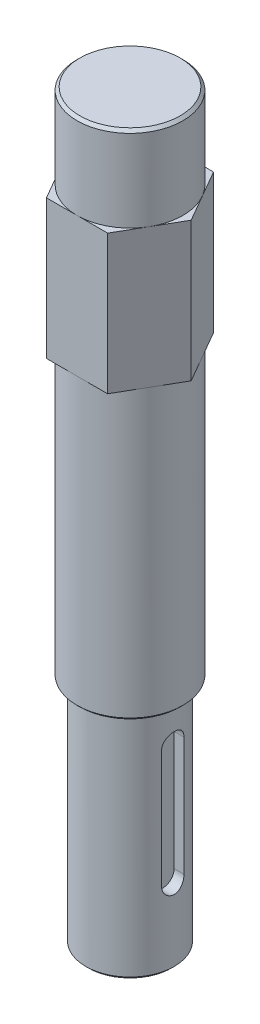
ISO-10303-21;
HEADER;
FILE_DESCRIPTION(('STEP AP214'),'2;1');
FILE_NAME('part.step','',(''),(''),'','','');
FILE_SCHEMA(('AUTOMOTIVE_DESIGN { 1 0 10303 214 1 1 1 1 }'));
ENDSEC;
DATA;
#1=APPLICATION_CONTEXT('core data for automotive mechanical design processes');
#2=APPLICATION_PROTOCOL_DEFINITION('international standard','automotive_design',2000,#1);
#3=PRODUCT_CONTEXT('',#1,'mechanical');
#4=PRODUCT('Part','Part','',(#3));
#5=PRODUCT_RELATED_PRODUCT_CATEGORY('part','',(#4));
#6=PRODUCT_DEFINITION_FORMATION('','',#4);
#7=PRODUCT_DEFINITION_CONTEXT('part definition',#1,'design');
#8=PRODUCT_DEFINITION('design','',#6,#7);
#9=PRODUCT_DEFINITION_SHAPE('','',#8);
#10=(LENGTH_UNIT() NAMED_UNIT(*) SI_UNIT(.MILLI.,.METRE.));
#11=(NAMED_UNIT(*) PLANE_ANGLE_UNIT() SI_UNIT($,.RADIAN.));
#12=(NAMED_UNIT(*) SI_UNIT($,.STERADIAN.) SOLID_ANGLE_UNIT());
#13=UNCERTAINTY_MEASURE_WITH_UNIT(LENGTH_MEASURE(1.E-05),#10,'distance_accuracy_value','');
#14=(GEOMETRIC_REPRESENTATION_CONTEXT(3) GLOBAL_UNCERTAINTY_ASSIGNED_CONTEXT((#13)) GLOBAL_UNIT_ASSIGNED_CONTEXT((#10,
#11,#12)) REPRESENTATION_CONTEXT('',''));
#15=CARTESIAN_POINT('',(0.,0.,0.));
#16=DIRECTION('',(0.,0.,1.));
#17=DIRECTION('',(1.,0.,0.));
#18=AXIS2_PLACEMENT_3D('',#15,#16,#17);
#19=CARTESIAN_POINT('',(0.,66.675,0.));
#20=DIRECTION('',(0.,1.,0.));
#21=DIRECTION('',(0.,0.,1.));
#22=AXIS2_PLACEMENT_3D('',#19,#20,#21);
#23=PLANE('',#22);
#24=CARTESIAN_POINT('',(0.,66.6749999999752,0.));
#25=DIRECTION('',(0.,-1.,0.));
#26=DIRECTION('',(0.,0.,-1.));
#27=AXIS2_PLACEMENT_3D('',#24,#25,#26);
#28=CIRCLE('',#27,4.50215000000753);
#29=CARTESIAN_POINT('',(0.,66.6749999999752,-4.50215000000753));
#30=VERTEX_POINT('',#29);
#31=EDGE_CURVE('E19',#30,#30,#28,.T.);
#32=ORIENTED_EDGE('',*,*,#31,.F.);
#33=EDGE_LOOP('',(#32));
#34=FACE_BOUND('',#33,.T.);
#35=ADVANCED_FACE('F16',(#34),#23,.T.);
#36=CARTESIAN_POINT('',(2.9591,6.85799999999999,0.));
#37=DIRECTION('',(1.,0.,0.));
#38=DIRECTION('',(0.,0.,-1.));
#39=AXIS2_PLACEMENT_3D('',#36,#37,#38);
#40=PLANE('',#39);
#41=CARTESIAN_POINT('',(2.9591,17.526,0.));
#42=DIRECTION('',(1.,0.,0.));
#43=DIRECTION('',(0.,0.,-1.));
#44=AXIS2_PLACEMENT_3D('',#41,#42,#43);
#45=CIRCLE('',#44,1.0033);
#46=CARTESIAN_POINT('',(2.9591,17.526,-1.0033));
#47=VERTEX_POINT('',#46);
#48=CARTESIAN_POINT('',(2.9591,17.526,1.0033));
#49=VERTEX_POINT('',#48);
#50=EDGE_CURVE('E108',#47,#49,#45,.T.);
#51=ORIENTED_EDGE('',*,*,#50,.T.);
#52=DIRECTION('',(0.,-1.,0.));
#53=VECTOR('',#52,1.);
#54=CARTESIAN_POINT('',(2.9591,6.85799999999999,1.0033));
#55=LINE('',#54,#53);
#56=CARTESIAN_POINT('',(2.9591,6.85799999999999,1.0033));
#57=VERTEX_POINT('',#56);
#58=EDGE_CURVE('E138',#49,#57,#55,.T.);
#59=ORIENTED_EDGE('',*,*,#58,.T.);
#60=CARTESIAN_POINT('',(2.9591,6.85799999999999,0.));
#61=DIRECTION('',(1.,0.,0.));
#62=DIRECTION('',(0.,0.,-1.));
#63=AXIS2_PLACEMENT_3D('',#60,#61,#62);
#64=CIRCLE('',#63,1.0033);
#65=CARTESIAN_POINT('',(2.9591,6.85799999999999,-1.0033));
#66=VERTEX_POINT('',#65);
#67=EDGE_CURVE('E111',#57,#66,#64,.T.);
#68=ORIENTED_EDGE('',*,*,#67,.T.);
#69=DIRECTION('',(0.,1.,0.));
#70=VECTOR('',#69,1.);
#71=CARTESIAN_POINT('',(2.9591,6.85799999999999,-1.0033));
#72=LINE('',#71,#70);
#73=EDGE_CURVE('E105',#66,#47,#72,.T.);
#74=ORIENTED_EDGE('',*,*,#73,.T.);
#75=EDGE_LOOP('',(#51,#59,#68,#74));
#76=FACE_BOUND('',#75,.T.);
#77=ADVANCED_FACE('F107',(#76),#40,.T.);
#78=CARTESIAN_POINT('',(0.,0.,0.));
#79=DIRECTION('',(0.,1.,0.));
#80=DIRECTION('',(0.,0.,1.));
#81=AXIS2_PLACEMENT_3D('',#78,#79,#80);
#82=PLANE('',#81);
#83=CARTESIAN_POINT('',(0.,-5.6843418860808E-11,0.));
#84=DIRECTION('',(0.,1.,0.));
#85=DIRECTION('',(0.,0.,1.));
#86=AXIS2_PLACEMENT_3D('',#83,#84,#85);
#87=CIRCLE('',#86,3.72110000000703);
#88=CARTESIAN_POINT('',(0.,-5.6843418860808E-11,3.72110000000703));
#89=VERTEX_POINT('',#88);
#90=EDGE_CURVE('E332',#89,#89,#87,.T.);
#91=ORIENTED_EDGE('',*,*,#90,.F.);
#92=EDGE_LOOP('',(#91));
#93=FACE_BOUND('',#92,.T.);
#94=ADVANCED_FACE('F512',(#93),#82,.F.);
#95=CARTESIAN_POINT('',(0.,66.4210000001049,0.));
#96=DIRECTION('',(0.,-1.,0.));
#97=DIRECTION('',(0.,0.,-1.));
#98=AXIS2_PLACEMENT_3D('',#95,#96,#97);
#99=CONICAL_SURFACE('',#98,4.75614999987783,0.785398163397448);
#100=CARTESIAN_POINT('',(0.,66.421,0.));
#101=DIRECTION('',(0.,1.,0.));
#102=DIRECTION('',(0.,0.,1.));
#103=AXIS2_PLACEMENT_3D('',#100,#101,#102);
#104=CIRCLE('',#103,4.75615);
#105=CARTESIAN_POINT('',(0.,66.421,4.75615));
#106=VERTEX_POINT('',#105);
#107=EDGE_CURVE('E133',#106,#106,#104,.F.);
#108=ORIENTED_EDGE('',*,*,#107,.F.);
#109=EDGE_LOOP('',(#108));
#110=FACE_BOUND('',#109,.T.);
#111=ORIENTED_EDGE('',*,*,#31,.T.);
#112=EDGE_LOOP('',(#111));
#113=FACE_BOUND('',#112,.T.);
#114=ADVANCED_FACE('F514',(#110,#113),#99,.T.);
#115=CARTESIAN_POINT('',(2.9591,17.526,0.));
#116=DIRECTION('',(1.,0.,0.));
#117=DIRECTION('',(0.,0.,-1.));
#118=AXIS2_PLACEMENT_3D('',#115,#116,#117);
#119=CYLINDRICAL_SURFACE('',#118,1.0033);
#120=CARTESIAN_POINT('',(3.84640210066498,17.526,1.0033));
#121=CARTESIAN_POINT('',(3.84640021219021,17.5537450835416,1.00330034876349));
#122=CARTESIAN_POINT('',(3.84670268090591,17.5814764096165,1.00214837980428));
#123=CARTESIAN_POINT('',(3.84789682428437,17.6367314815848,0.997556222563806));
#124=CARTESIAN_POINT('',(3.84878839837138,17.6642552621005,0.994116424874347));
#125=CARTESIAN_POINT('',(3.85231090021124,17.7461018554754,0.980415703257158));
#126=CARTESIAN_POINT('',(3.85578983048652,17.7998619414397,0.966773227972432));
#127=CARTESIAN_POINT('',(3.86460297024038,17.9042335388805,0.930913533188461));
#128=CARTESIAN_POINT('',(3.86993698485091,17.9548453804075,0.908697214305049));
#129=CARTESIAN_POINT('',(3.88185615984626,18.0516495012558,0.856347567145543));
#130=CARTESIAN_POINT('',(3.88844166649615,18.0978405520938,0.82621204688513));
#131=CARTESIAN_POINT('',(3.90228537003188,18.1854970014703,0.75816563120082));
#132=CARTESIAN_POINT('',(3.90955441769731,18.2268489089157,0.720110781553767));
#133=CARTESIAN_POINT('',(3.92385274280157,18.3026595556272,0.637612421940079));
#134=CARTESIAN_POINT('',(3.93088198168583,18.3371171907781,0.593167890623755));
#135=CARTESIAN_POINT('',(3.94402916755263,18.3986254823347,0.498369916657886));
#136=CARTESIAN_POINT('',(3.95013272116901,18.4255637425614,0.447941380243563));
#137=CARTESIAN_POINT('',(3.96061581347589,18.4705365519287,0.343094437156055));
#138=CARTESIAN_POINT('',(3.96499569598819,18.4885728769267,0.288676828757295));
#139=CARTESIAN_POINT('',(3.9714611839942,18.5148654023669,0.178584974470678));
#140=CARTESIAN_POINT('',(3.97359222988791,18.5233155774075,0.122959769131071));
#141=CARTESIAN_POINT('',(3.97547838126792,18.5308050735213,0.0110419449280236));
#142=CARTESIAN_POINT('',(3.97523379202014,18.529845603721,-0.0452505872563587));
#143=CARTESIAN_POINT('',(3.97242988958149,18.5186817818397,-0.155556589092156));
#144=CARTESIAN_POINT('',(3.96992306050483,18.5086870395671,-0.209592808263602));
#145=CARTESIAN_POINT('',(3.96293761340165,18.4800736558221,-0.315194357023057));
#146=CARTESIAN_POINT('',(3.95845890718762,18.4614546286472,-0.366759575987102));
#147=CARTESIAN_POINT('',(3.94795293080852,18.4159526343771,-0.466506374569887));
#148=CARTESIAN_POINT('',(3.94191181882371,18.388995354831,-0.514652536713082));
#149=CARTESIAN_POINT('',(3.92893591933964,18.3276390301342,-0.605809834232611));
#150=CARTESIAN_POINT('',(3.9220009941908,18.2932388382004,-0.648820176709634));
#151=CARTESIAN_POINT('',(3.90776756074446,18.2168558188777,-0.729731887061486));
#152=CARTESIAN_POINT('',(3.90046429793555,18.1746906493815,-0.767460448506101));
#153=CARTESIAN_POINT('',(3.88648954666622,18.0845432529751,-0.835358900253564));
#154=CARTESIAN_POINT('',(3.87981823162958,18.0365594374592,-0.865526719398301));
#155=CARTESIAN_POINT('',(3.86784401427835,17.9357849862623,-0.917563243803616));
#156=CARTESIAN_POINT('',(3.86254892019902,17.8829691268956,-0.939384911545592));
#157=CARTESIAN_POINT('',(3.8540285049891,17.7742834840963,-0.97375723275708));
#158=CARTESIAN_POINT('',(3.85080008889816,17.7184184038498,-0.98632175357635));
#159=CARTESIAN_POINT('',(3.84800639706562,17.639389796184,-0.997132711874985));
#160=CARTESIAN_POINT('',(3.84740573138019,17.616759101629,-0.999445818469873));
#161=CARTESIAN_POINT('',(3.84660375195641,17.5714225353143,-1.00252773955185));
#162=CARTESIAN_POINT('',(3.84640179392861,17.5487168443286,-1.00329904552852));
#163=CARTESIAN_POINT('',(3.84640210066498,17.526,-1.0033));
#164=B_SPLINE_CURVE_WITH_KNOTS('',3,(#120,#121,#122,#123,#124,#125,#126,#127,#128,#129,#130,
#131,#132,#133,#134,#135,#136,#137,#138,#139,#140,#141,#142,#143,#144,#145,#146,#147,#148,#149,
#150,#151,#152,#153,#154,#155,#156,#157,#158,#159,#160,#161,#162,#163),.UNSPECIFIED.,.F.,.F.,(4,
2,2,2,2,2,2,2,2,2,2,2,2,2,2,2,2,2,2,2,2,4),(0.,0.083182639662903,0.166351081531982,
0.332208251260774,0.498048003718996,0.663933707999471,0.833149778793497,1.00239292782742,
1.17404475886768,1.3456623330293,1.51374158593666,1.68179924117224,1.8460554386764,
2.01031898289317,2.17609085113485,2.3418882792542,2.51224032370069,2.68263898279222,
2.85398430553793,3.02507242552327,3.09329714974373,3.16141153605966),.UNSPECIFIED.);
#165=CARTESIAN_POINT('',(3.84640210066498,17.526,1.0033));
#166=VERTEX_POINT('',#165);
#167=CARTESIAN_POINT('',(3.84640210066498,17.526,-1.0033));
#168=VERTEX_POINT('',#167);
#169=EDGE_CURVE('E193',#166,#168,#164,.T.);
#170=ORIENTED_EDGE('',*,*,#169,.F.);
#171=DIRECTION('',(1.,0.,0.));
#172=VECTOR('',#171,1.);
#173=CARTESIAN_POINT('',(2.9591,17.526,1.0033));
#174=LINE('',#173,#172);
#175=EDGE_CURVE('E121',#166,#49,#174,.F.);
#176=ORIENTED_EDGE('',*,*,#175,.T.);
#177=ORIENTED_EDGE('',*,*,#50,.F.);
#178=DIRECTION('',(1.,0.,0.));
#179=VECTOR('',#178,1.);
#180=CARTESIAN_POINT('',(2.9591,17.526,-1.0033));
#181=LINE('',#180,#179);
#182=EDGE_CURVE('E115',#47,#168,#181,.T.);
#183=ORIENTED_EDGE('',*,*,#182,.T.);
#184=EDGE_LOOP('',(#170,#176,#177,#183));
#185=FACE_BOUND('',#184,.T.);
#186=ADVANCED_FACE('F118',(#185),#119,.F.);
#187=CARTESIAN_POINT('',(2.9591,6.85799999999999,-1.0033));
#188=DIRECTION('',(0.,0.,-1.));
#189=DIRECTION('',(0.,1.,0.));
#190=AXIS2_PLACEMENT_3D('',#187,#188,#189);
#191=PLANE('',#190);
#192=ORIENTED_EDGE('',*,*,#182,.F.);
#193=ORIENTED_EDGE('',*,*,#73,.F.);
#194=DIRECTION('',(1.,0.,0.));
#195=VECTOR('',#194,1.);
#196=CARTESIAN_POINT('',(2.9591,6.85799999999999,-1.0033));
#197=LINE('',#196,#195);
#198=CARTESIAN_POINT('',(3.84640210066498,6.85799999999999,-1.0033));
#199=VERTEX_POINT('',#198);
#200=EDGE_CURVE('E128',#66,#199,#197,.T.);
#201=ORIENTED_EDGE('',*,*,#200,.T.);
#202=DIRECTION('',(0.,-1.,0.));
#203=VECTOR('',#202,1.);
#204=CARTESIAN_POINT('',(3.84640210066498,20.701,-1.0033));
#205=LINE('',#204,#203);
#206=EDGE_CURVE('E125',#168,#199,#205,.T.);
#207=ORIENTED_EDGE('',*,*,#206,.F.);
#208=EDGE_LOOP('',(#192,#193,#201,#207));
#209=FACE_BOUND('',#208,.T.);
#210=ADVANCED_FACE('F123',(#209),#191,.F.);
#211=CARTESIAN_POINT('',(2.9591,6.85799999999999,0.));
#212=DIRECTION('',(1.,0.,0.));
#213=DIRECTION('',(0.,0.,-1.));
#214=AXIS2_PLACEMENT_3D('',#211,#212,#213);
#215=CYLINDRICAL_SURFACE('',#214,1.0033);
#216=CARTESIAN_POINT('',(3.84640210066498,6.85799999999999,-1.0033));
#217=CARTESIAN_POINT('',(3.84640021219021,6.83025491645841,-1.00330034876349));
#218=CARTESIAN_POINT('',(3.84670268090591,6.80252359038346,-1.00214837980428));
#219=CARTESIAN_POINT('',(3.84789682428437,6.7472685184152,-0.997556222563807));
#220=CARTESIAN_POINT('',(3.84878839837138,6.71974473789953,-0.994116424874347));
#221=CARTESIAN_POINT('',(3.85231090021124,6.63789814452458,-0.980415703257158));
#222=CARTESIAN_POINT('',(3.85578983048652,6.58413805856026,-0.966773227972432));
#223=CARTESIAN_POINT('',(3.86460297024038,6.47976646111946,-0.930913533188462));
#224=CARTESIAN_POINT('',(3.86993698485091,6.42915461959247,-0.90869721430505));
#225=CARTESIAN_POINT('',(3.88185615984626,6.3323504987442,-0.856347567145545));
#226=CARTESIAN_POINT('',(3.88844166649615,6.28615944790618,-0.826212046885132));
#227=CARTESIAN_POINT('',(3.90228537003188,6.19850299852966,-0.758165631200823));
#228=CARTESIAN_POINT('',(3.90955441769731,6.15715109108425,-0.720110781553771));
#229=CARTESIAN_POINT('',(3.92385274280157,6.08134044437274,-0.637612421940081));
#230=CARTESIAN_POINT('',(3.93088198168583,6.04688280922189,-0.593167890623756));
#231=CARTESIAN_POINT('',(3.94402916755263,5.98537451766533,-0.498369916657886));
#232=CARTESIAN_POINT('',(3.95013272116901,5.95843625743859,-0.447941380243563));
#233=CARTESIAN_POINT('',(3.96061581347589,5.91346344807126,-0.343094437156057));
#234=CARTESIAN_POINT('',(3.96499569598819,5.89542712307324,-0.288676828757297));
#235=CARTESIAN_POINT('',(3.9714611839942,5.86913459763313,-0.17858497447068));
#236=CARTESIAN_POINT('',(3.97359222988791,5.8606844225925,-0.122959769131073));
#237=CARTESIAN_POINT('',(3.97547838126792,5.85319492647871,-0.0110419449280263));
#238=CARTESIAN_POINT('',(3.97523379202014,5.85415439627904,0.0452505872563561));
#239=CARTESIAN_POINT('',(3.97242988958149,5.8653182181603,0.155556589092154));
#240=CARTESIAN_POINT('',(3.96992306050483,5.8753129604329,0.2095928082636));
#241=CARTESIAN_POINT('',(3.96293761340165,5.90392634417792,0.315194357023055));
#242=CARTESIAN_POINT('',(3.95845890718762,5.92254537135284,0.3667595759871));
#243=CARTESIAN_POINT('',(3.94795293080852,5.96804736562284,0.466506374569886));
#244=CARTESIAN_POINT('',(3.94191181882371,5.99500464516895,0.51465253671308));
#245=CARTESIAN_POINT('',(3.92893591933964,6.05636096986578,0.60580983423261));
#246=CARTESIAN_POINT('',(3.9220009941908,6.09076116179961,0.648820176709634));
#247=CARTESIAN_POINT('',(3.90776756074446,6.16714418112231,0.729731887061486));
#248=CARTESIAN_POINT('',(3.90046429793555,6.20930935061847,0.7674604485061));
#249=CARTESIAN_POINT('',(3.88648954666622,6.29945674702485,0.835358900253563));
#250=CARTESIAN_POINT('',(3.87981823162958,6.34744056254077,0.8655267193983));
#251=CARTESIAN_POINT('',(3.86784401427835,6.44821501373765,0.917563243803616));
#252=CARTESIAN_POINT('',(3.86254892019902,6.5010308731044,0.939384911545592));
#253=CARTESIAN_POINT('',(3.8540285049891,6.60971651590368,0.97375723275708));
#254=CARTESIAN_POINT('',(3.85080008889816,6.66558159615018,0.98632175357635));
#255=CARTESIAN_POINT('',(3.84800639706562,6.74461020381603,0.997132711874985));
#256=CARTESIAN_POINT('',(3.84740573138019,6.76724089837101,0.999445818469873));
#257=CARTESIAN_POINT('',(3.84660375195641,6.8125774646857,1.00252773955185));
#258=CARTESIAN_POINT('',(3.84640179392861,6.83528315567134,1.00329904552852));
#259=CARTESIAN_POINT('',(3.84640210066498,6.85799999999999,1.0033));
#260=B_SPLINE_CURVE_WITH_KNOTS('',3,(#216,#217,#218,#219,#220,#221,#222,#223,#224,#225,#226,
#227,#228,#229,#230,#231,#232,#233,#234,#235,#236,#237,#238,#239,#240,#241,#242,#243,#244,#245,
#246,#247,#248,#249,#250,#251,#252,#253,#254,#255,#256,#257,#258,#259),.UNSPECIFIED.,.F.,.F.,(4,
2,2,2,2,2,2,2,2,2,2,2,2,2,2,2,2,2,2,2,2,4),(0.,0.083182639662903,0.166351081531981,
0.332208251260774,0.498048003718991,0.663933707999465,0.833149778793493,1.00239292782742,
1.17404475886768,1.3456623330293,1.51374158593666,1.68179924117224,1.8460554386764,
2.01031898289317,2.17609085113485,2.3418882792542,2.51224032370069,2.68263898279222,
2.85398430553793,3.02507242552326,3.09329714974373,3.16141153605966),.UNSPECIFIED.);
#261=CARTESIAN_POINT('',(3.84640210066498,6.85799999999999,1.0033));
#262=VERTEX_POINT('',#261);
#263=EDGE_CURVE('E183',#199,#262,#260,.T.);
#264=ORIENTED_EDGE('',*,*,#263,.F.);
#265=ORIENTED_EDGE('',*,*,#200,.F.);
#266=ORIENTED_EDGE('',*,*,#67,.F.);
#267=DIRECTION('',(1.,0.,0.));
#268=VECTOR('',#267,1.);
#269=CARTESIAN_POINT('',(2.9591,6.85799999999999,1.0033));
#270=LINE('',#269,#268);
#271=EDGE_CURVE('E139',#57,#262,#270,.T.);
#272=ORIENTED_EDGE('',*,*,#271,.T.);
#273=EDGE_LOOP('',(#264,#265,#266,#272));
#274=FACE_BOUND('',#273,.T.);
#275=ADVANCED_FACE('F200',(#274),#215,.F.);
#276=CARTESIAN_POINT('',(2.9591,6.85799999999999,1.0033));
#277=DIRECTION('',(0.,0.,1.));
#278=DIRECTION('',(0.,-1.,0.));
#279=AXIS2_PLACEMENT_3D('',#276,#277,#278);
#280=PLANE('',#279);
#281=ORIENTED_EDGE('',*,*,#271,.F.);
#282=ORIENTED_EDGE('',*,*,#58,.F.);
#283=ORIENTED_EDGE('',*,*,#175,.F.);
#284=DIRECTION('',(0.,-1.,0.));
#285=VECTOR('',#284,1.);
#286=CARTESIAN_POINT('',(3.84640210066498,20.701,1.0033));
#287=LINE('',#286,#285);
#288=EDGE_CURVE('E192',#262,#166,#287,.F.);
#289=ORIENTED_EDGE('',*,*,#288,.F.);
#290=EDGE_LOOP('',(#281,#282,#283,#289));
#291=FACE_BOUND('',#290,.T.);
#292=ADVANCED_FACE('F227',(#291),#280,.F.);
#293=CARTESIAN_POINT('',(0.,0.253999999927146,0.));
#294=DIRECTION('',(0.,1.,0.));
#295=DIRECTION('',(0.,0.,1.));
#296=AXIS2_PLACEMENT_3D('',#293,#294,#295);
#297=CONICAL_SURFACE('',#296,3.97509999999102,0.785398163397448);
#298=ORIENTED_EDGE('',*,*,#90,.T.);
#299=EDGE_LOOP('',(#298));
#300=FACE_BOUND('',#299,.T.);
#301=CARTESIAN_POINT('',(0.,0.254000000000001,0.));
#302=DIRECTION('',(0.,-1.,0.));
#303=DIRECTION('',(0.,0.,-1.));
#304=AXIS2_PLACEMENT_3D('',#301,#302,#303);
#305=CIRCLE('',#304,3.9751);
#306=CARTESIAN_POINT('',(0.,0.254000000000001,-3.9751));
#307=VERTEX_POINT('',#306);
#308=EDGE_CURVE('E345',#307,#307,#305,.F.);
#309=ORIENTED_EDGE('',*,*,#308,.F.);
#310=EDGE_LOOP('',(#309));
#311=FACE_BOUND('',#310,.T.);
#312=ADVANCED_FACE('F224',(#300,#311),#297,.T.);
#313=CARTESIAN_POINT('',(0.,59.055,0.));
#314=DIRECTION('',(0.,1.,0.));
#315=DIRECTION('',(0.,0.,1.));
#316=AXIS2_PLACEMENT_3D('',#313,#314,#315);
#317=PLANE('',#316);
#318=DIRECTION('',(-0.5,0.,-0.866025403784439));
#319=VECTOR('',#318,1.);
#320=CARTESIAN_POINT('',(-5.49192896561248,59.055,0.));
#321=LINE('',#320,#319);
#322=CARTESIAN_POINT('',(-5.49192896561248,59.055,0.));
#323=VERTEX_POINT('',#322);
#324=CARTESIAN_POINT('',(-4.11894672420936,59.055,2.378075));
#325=VERTEX_POINT('',#324);
#326=EDGE_CURVE('E329',#323,#325,#321,.F.);
#327=ORIENTED_EDGE('',*,*,#326,.T.);
#328=CARTESIAN_POINT('',(0.,59.055,0.));
#329=DIRECTION('',(0.,1.,0.));
#330=DIRECTION('',(0.,0.,1.));
#331=AXIS2_PLACEMENT_3D('',#328,#329,#330);
#332=CIRCLE('',#331,4.75615);
#333=CARTESIAN_POINT('',(-4.11894672420936,59.055,-2.378075));
#334=VERTEX_POINT('',#333);
#335=EDGE_CURVE('E137',#325,#334,#332,.F.);
#336=ORIENTED_EDGE('',*,*,#335,.T.);
#337=DIRECTION('',(0.5,0.,-0.866025403784439));
#338=VECTOR('',#337,1.);
#339=CARTESIAN_POINT('',(-2.74596448280624,59.055,-4.75615));
#340=LINE('',#339,#338);
#341=EDGE_CURVE('E324',#334,#323,#340,.F.);
#342=ORIENTED_EDGE('',*,*,#341,.T.);
#343=EDGE_LOOP('',(#327,#336,#342));
#344=FACE_BOUND('',#343,.T.);
#345=ADVANCED_FACE('F220',(#344),#317,.T.);
#346=CARTESIAN_POINT('',(0.,59.055,0.));
#347=DIRECTION('',(0.,1.,0.));
#348=DIRECTION('',(0.,0.,1.));
#349=AXIS2_PLACEMENT_3D('',#346,#347,#348);
#350=CYLINDRICAL_SURFACE('',#349,4.75615);
#351=ORIENTED_EDGE('',*,*,#107,.T.);
#352=EDGE_LOOP('',(#351));
#353=FACE_BOUND('',#352,.T.);
#354=CARTESIAN_POINT('',(0.,59.055,0.));
#355=DIRECTION('',(0.,1.,0.));
#356=DIRECTION('',(0.,0.,1.));
#357=AXIS2_PLACEMENT_3D('',#354,#355,#356);
#358=CIRCLE('',#357,4.75615);
#359=CARTESIAN_POINT('',(4.11894672420936,59.055,2.378075));
#360=VERTEX_POINT('',#359);
#361=CARTESIAN_POINT('',(0.,59.055,4.75615));
#362=VERTEX_POINT('',#361);
#363=EDGE_CURVE('E171',#360,#362,#358,.F.);
#364=ORIENTED_EDGE('',*,*,#363,.F.);
#365=CARTESIAN_POINT('',(0.,59.055,0.));
#366=DIRECTION('',(0.,1.,0.));
#367=DIRECTION('',(0.,0.,1.));
#368=AXIS2_PLACEMENT_3D('',#365,#366,#367);
#369=CIRCLE('',#368,4.75615);
#370=CARTESIAN_POINT('',(4.11894672420936,59.055,-2.378075));
#371=VERTEX_POINT('',#370);
#372=EDGE_CURVE('E167',#371,#360,#369,.F.);
#373=ORIENTED_EDGE('',*,*,#372,.F.);
#374=CARTESIAN_POINT('',(0.,59.055,0.));
#375=DIRECTION('',(0.,1.,0.));
#376=DIRECTION('',(0.,0.,1.));
#377=AXIS2_PLACEMENT_3D('',#374,#375,#376);
#378=CIRCLE('',#377,4.75615);
#379=CARTESIAN_POINT('',(0.,59.055,-4.75615));
#380=VERTEX_POINT('',#379);
#381=EDGE_CURVE('E174',#380,#371,#378,.F.);
#382=ORIENTED_EDGE('',*,*,#381,.F.);
#383=CARTESIAN_POINT('',(0.,59.055,0.));
#384=DIRECTION('',(0.,1.,0.));
#385=DIRECTION('',(0.,0.,1.));
#386=AXIS2_PLACEMENT_3D('',#383,#384,#385);
#387=CIRCLE('',#386,4.75615);
#388=EDGE_CURVE('E178',#334,#380,#387,.F.);
#389=ORIENTED_EDGE('',*,*,#388,.F.);
#390=ORIENTED_EDGE('',*,*,#335,.F.);
#391=CARTESIAN_POINT('',(0.,59.055,0.));
#392=DIRECTION('',(0.,1.,0.));
#393=DIRECTION('',(0.,0.,1.));
#394=AXIS2_PLACEMENT_3D('',#391,#392,#393);
#395=CIRCLE('',#394,4.75615);
#396=EDGE_CURVE('E136',#362,#325,#395,.F.);
#397=ORIENTED_EDGE('',*,*,#396,.F.);
#398=EDGE_LOOP('',(#364,#373,#382,#389,#390,#397));
#399=FACE_BOUND('',#398,.T.);
#400=ADVANCED_FACE('F216',(#353,#399),#350,.T.);
#401=CARTESIAN_POINT('',(0.,59.055,0.));
#402=DIRECTION('',(0.,1.,0.));
#403=DIRECTION('',(0.,0.,1.));
#404=AXIS2_PLACEMENT_3D('',#401,#402,#403);
#405=PLANE('',#404);
#406=DIRECTION('',(-1.,0.,0.));
#407=VECTOR('',#406,1.);
#408=CARTESIAN_POINT('',(-2.74596448280624,59.055,4.75615));
#409=LINE('',#408,#407);
#410=CARTESIAN_POINT('',(-2.74596448280624,59.055,4.75615));
#411=VERTEX_POINT('',#410);
#412=EDGE_CURVE('E356',#411,#362,#409,.F.);
#413=ORIENTED_EDGE('',*,*,#412,.T.);
#414=ORIENTED_EDGE('',*,*,#396,.T.);
#415=DIRECTION('',(-0.5,0.,-0.866025403784439));
#416=VECTOR('',#415,1.);
#417=CARTESIAN_POINT('',(-5.49192896561248,59.055,0.));
#418=LINE('',#417,#416);
#419=EDGE_CURVE('E182',#325,#411,#418,.F.);
#420=ORIENTED_EDGE('',*,*,#419,.T.);
#421=EDGE_LOOP('',(#413,#414,#420));
#422=FACE_BOUND('',#421,.T.);
#423=ADVANCED_FACE('F210',(#422),#405,.T.);
#424=CARTESIAN_POINT('',(0.,20.701,0.));
#425=DIRECTION('',(0.,-1.,0.));
#426=DIRECTION('',(0.,0.,-1.));
#427=AXIS2_PLACEMENT_3D('',#424,#425,#426);
#428=CYLINDRICAL_SURFACE('',#427,3.9751);
#429=CARTESIAN_POINT('',(0.,20.701,0.));
#430=DIRECTION('',(0.,-1.,0.));
#431=DIRECTION('',(0.,0.,-1.));
#432=AXIS2_PLACEMENT_3D('',#429,#430,#431);
#433=CIRCLE('',#432,3.9751);
#434=CARTESIAN_POINT('',(0.,20.701,-3.9751));
#435=VERTEX_POINT('',#434);
#436=EDGE_CURVE('E162',#435,#435,#433,.F.);
#437=ORIENTED_EDGE('',*,*,#436,.F.);
#438=EDGE_LOOP('',(#437));
#439=FACE_BOUND('',#438,.T.);
#440=ORIENTED_EDGE('',*,*,#308,.T.);
#441=EDGE_LOOP('',(#440));
#442=FACE_BOUND('',#441,.T.);
#443=ORIENTED_EDGE('',*,*,#263,.T.);
#444=ORIENTED_EDGE('',*,*,#288,.T.);
#445=ORIENTED_EDGE('',*,*,#169,.T.);
#446=ORIENTED_EDGE('',*,*,#206,.T.);
#447=EDGE_LOOP('',(#443,#444,#445,#446));
#448=FACE_BOUND('',#447,.T.);
#449=ADVANCED_FACE('F204',(#439,#442,#448),#428,.T.);
#450=CARTESIAN_POINT('',(-5.49192896561248,66.675,0.));
#451=DIRECTION('',(0.866025403784439,0.,-0.5));
#452=DIRECTION('',(-0.5,0.,-0.866025403784439));
#453=AXIS2_PLACEMENT_3D('',#450,#451,#452);
#454=PLANE('',#453);
#455=DIRECTION('',(0.,1.,0.));
#456=VECTOR('',#455,1.);
#457=CARTESIAN_POINT('',(-2.74596448280624,66.675,4.75615));
#458=LINE('',#457,#456);
#459=CARTESIAN_POINT('',(-2.74596448280624,46.5582,4.75615));
#460=VERTEX_POINT('',#459);
#461=EDGE_CURVE('E170',#460,#411,#458,.T.);
#462=ORIENTED_EDGE('',*,*,#461,.T.);
#463=ORIENTED_EDGE('',*,*,#419,.F.);
#464=ORIENTED_EDGE('',*,*,#326,.F.);
#465=DIRECTION('',(0.,1.,0.));
#466=VECTOR('',#465,1.);
#467=CARTESIAN_POINT('',(-5.49192896561248,66.675,0.));
#468=LINE('',#467,#466);
#469=CARTESIAN_POINT('',(-5.49192896561248,46.5582,0.));
#470=VERTEX_POINT('',#469);
#471=EDGE_CURVE('E177',#323,#470,#468,.F.);
#472=ORIENTED_EDGE('',*,*,#471,.T.);
#473=DIRECTION('',(-0.5,0.,-0.866025403784439));
#474=VECTOR('',#473,1.);
#475=CARTESIAN_POINT('',(-4.11894672420936,46.5582,2.378075));
#476=LINE('',#475,#474);
#477=CARTESIAN_POINT('',(-4.11894672420936,46.5582,2.378075));
#478=VERTEX_POINT('',#477);
#479=EDGE_CURVE('E426',#478,#470,#476,.T.);
#480=ORIENTED_EDGE('',*,*,#479,.F.);
#481=DIRECTION('',(-0.500000000000001,0.,-0.866025403784438));
#482=VECTOR('',#481,1.);
#483=CARTESIAN_POINT('',(-2.74596448280624,46.5582,4.75615));
#484=LINE('',#483,#482);
#485=EDGE_CURVE('E165',#460,#478,#484,.T.);
#486=ORIENTED_EDGE('',*,*,#485,.F.);
#487=EDGE_LOOP('',(#462,#463,#464,#472,#480,#486));
#488=FACE_BOUND('',#487,.T.);
#489=ADVANCED_FACE('F209',(#488),#454,.F.);
#490=CARTESIAN_POINT('',(0.,59.055,0.));
#491=DIRECTION('',(0.,1.,0.));
#492=DIRECTION('',(0.,0.,1.));
#493=AXIS2_PLACEMENT_3D('',#490,#491,#492);
#494=PLANE('',#493);
#495=DIRECTION('',(0.5,0.,-0.866025403784439));
#496=VECTOR('',#495,1.);
#497=CARTESIAN_POINT('',(-2.74596448280624,59.055,-4.75615));
#498=LINE('',#497,#496);
#499=CARTESIAN_POINT('',(-2.74596448280624,59.055,-4.75615));
#500=VERTEX_POINT('',#499);
#501=EDGE_CURVE('E181',#500,#334,#498,.F.);
#502=ORIENTED_EDGE('',*,*,#501,.T.);
#503=ORIENTED_EDGE('',*,*,#388,.T.);
#504=DIRECTION('',(1.,0.,0.));
#505=VECTOR('',#504,1.);
#506=CARTESIAN_POINT('',(2.74596448280624,59.055,-4.75615));
#507=LINE('',#506,#505);
#508=EDGE_CURVE('E320',#380,#500,#507,.F.);
#509=ORIENTED_EDGE('',*,*,#508,.T.);
#510=EDGE_LOOP('',(#502,#503,#509));
#511=FACE_BOUND('',#510,.T.);
#512=ADVANCED_FACE('F307',(#511),#494,.T.);
#513=CARTESIAN_POINT('',(-2.74596448280624,66.675,-4.75615));
#514=DIRECTION('',(0.866025403784439,0.,0.5));
#515=DIRECTION('',(0.5,0.,-0.866025403784439));
#516=AXIS2_PLACEMENT_3D('',#513,#514,#515);
#517=PLANE('',#516);
#518=ORIENTED_EDGE('',*,*,#471,.F.);
#519=ORIENTED_EDGE('',*,*,#341,.F.);
#520=ORIENTED_EDGE('',*,*,#501,.F.);
#521=DIRECTION('',(0.,1.,0.));
#522=VECTOR('',#521,1.);
#523=CARTESIAN_POINT('',(-2.74596448280624,66.675,-4.75615));
#524=LINE('',#523,#522);
#525=CARTESIAN_POINT('',(-2.74596448280624,46.5582,-4.75615));
#526=VERTEX_POINT('',#525);
#527=EDGE_CURVE('E400',#500,#526,#524,.F.);
#528=ORIENTED_EDGE('',*,*,#527,.T.);
#529=DIRECTION('',(0.5,0.,-0.866025403784439));
#530=VECTOR('',#529,1.);
#531=CARTESIAN_POINT('',(-4.11894672420936,46.5582,-2.378075));
#532=LINE('',#531,#530);
#533=CARTESIAN_POINT('',(-4.11894672420936,46.5582,-2.378075));
#534=VERTEX_POINT('',#533);
#535=EDGE_CURVE('E390',#534,#526,#532,.T.);
#536=ORIENTED_EDGE('',*,*,#535,.F.);
#537=DIRECTION('',(0.5,0.,-0.866025403784439));
#538=VECTOR('',#537,1.);
#539=CARTESIAN_POINT('',(-5.49192896561248,46.5582,0.));
#540=LINE('',#539,#538);
#541=EDGE_CURVE('E431',#470,#534,#540,.T.);
#542=ORIENTED_EDGE('',*,*,#541,.F.);
#543=EDGE_LOOP('',(#518,#519,#520,#528,#536,#542));
#544=FACE_BOUND('',#543,.T.);
#545=ADVANCED_FACE('F304',(#544),#517,.F.);
#546=CARTESIAN_POINT('',(0.,59.055,0.));
#547=DIRECTION('',(0.,1.,0.));
#548=DIRECTION('',(0.,0.,1.));
#549=AXIS2_PLACEMENT_3D('',#546,#547,#548);
#550=PLANE('',#549);
#551=DIRECTION('',(1.,0.,0.));
#552=VECTOR('',#551,1.);
#553=CARTESIAN_POINT('',(2.74596448280624,59.055,-4.75615));
#554=LINE('',#553,#552);
#555=CARTESIAN_POINT('',(2.74596448280624,59.055,-4.75615));
#556=VERTEX_POINT('',#555);
#557=EDGE_CURVE('E387',#556,#380,#554,.F.);
#558=ORIENTED_EDGE('',*,*,#557,.T.);
#559=ORIENTED_EDGE('',*,*,#381,.T.);
#560=DIRECTION('',(0.5,0.,0.866025403784439));
#561=VECTOR('',#560,1.);
#562=CARTESIAN_POINT('',(5.49192896561248,59.055,0.));
#563=LINE('',#562,#561);
#564=EDGE_CURVE('E393',#371,#556,#563,.F.);
#565=ORIENTED_EDGE('',*,*,#564,.T.);
#566=EDGE_LOOP('',(#558,#559,#565));
#567=FACE_BOUND('',#566,.T.);
#568=ADVANCED_FACE('F300',(#567),#550,.T.);
#569=CARTESIAN_POINT('',(0.,59.055,0.));
#570=DIRECTION('',(0.,1.,0.));
#571=DIRECTION('',(0.,0.,1.));
#572=AXIS2_PLACEMENT_3D('',#569,#570,#571);
#573=PLANE('',#572);
#574=DIRECTION('',(-0.5,0.,0.866025403784439));
#575=VECTOR('',#574,1.);
#576=CARTESIAN_POINT('',(2.74596448280624,59.055,4.75615));
#577=LINE('',#576,#575);
#578=CARTESIAN_POINT('',(2.74596448280624,59.055,4.75615));
#579=VERTEX_POINT('',#578);
#580=EDGE_CURVE('E446',#579,#360,#577,.F.);
#581=ORIENTED_EDGE('',*,*,#580,.T.);
#582=ORIENTED_EDGE('',*,*,#363,.T.);
#583=DIRECTION('',(-1.,0.,0.));
#584=VECTOR('',#583,1.);
#585=CARTESIAN_POINT('',(-2.74596448280624,59.055,4.75615));
#586=LINE('',#585,#584);
#587=EDGE_CURVE('E166',#362,#579,#586,.F.);
#588=ORIENTED_EDGE('',*,*,#587,.T.);
#589=EDGE_LOOP('',(#581,#582,#588));
#590=FACE_BOUND('',#589,.T.);
#591=ADVANCED_FACE('F296',(#590),#573,.T.);
#592=CARTESIAN_POINT('',(0.,59.055,0.));
#593=DIRECTION('',(0.,1.,0.));
#594=DIRECTION('',(0.,0.,1.));
#595=AXIS2_PLACEMENT_3D('',#592,#593,#594);
#596=PLANE('',#595);
#597=ORIENTED_EDGE('',*,*,#372,.T.);
#598=DIRECTION('',(-0.5,0.,0.866025403784439));
#599=VECTOR('',#598,1.);
#600=CARTESIAN_POINT('',(2.74596448280624,59.055,4.75615));
#601=LINE('',#600,#599);
#602=CARTESIAN_POINT('',(5.49192896561248,59.055,0.));
#603=VERTEX_POINT('',#602);
#604=EDGE_CURVE('E451',#360,#603,#601,.F.);
#605=ORIENTED_EDGE('',*,*,#604,.T.);
#606=DIRECTION('',(0.5,0.,0.866025403784439));
#607=VECTOR('',#606,1.);
#608=CARTESIAN_POINT('',(5.49192896561248,59.055,0.));
#609=LINE('',#608,#607);
#610=EDGE_CURVE('E397',#603,#371,#609,.F.);
#611=ORIENTED_EDGE('',*,*,#610,.T.);
#612=EDGE_LOOP('',(#597,#605,#611));
#613=FACE_BOUND('',#612,.T.);
#614=ADVANCED_FACE('F292',(#613),#596,.T.);
#615=CARTESIAN_POINT('',(-2.74596448280624,66.675,4.75615));
#616=DIRECTION('',(0.,0.,-1.));
#617=DIRECTION('',(-1.,0.,0.));
#618=AXIS2_PLACEMENT_3D('',#615,#616,#617);
#619=PLANE('',#618);
#620=DIRECTION('',(0.,1.,0.));
#621=VECTOR('',#620,1.);
#622=CARTESIAN_POINT('',(2.74596448280624,66.675,4.75615));
#623=LINE('',#622,#621);
#624=CARTESIAN_POINT('',(2.74596448280624,46.5582,4.75615));
#625=VERTEX_POINT('',#624);
#626=EDGE_CURVE('E377',#625,#579,#623,.T.);
#627=ORIENTED_EDGE('',*,*,#626,.T.);
#628=ORIENTED_EDGE('',*,*,#587,.F.);
#629=ORIENTED_EDGE('',*,*,#412,.F.);
#630=ORIENTED_EDGE('',*,*,#461,.F.);
#631=DIRECTION('',(1.,0.,0.));
#632=VECTOR('',#631,1.);
#633=CARTESIAN_POINT('',(0.,46.5582,4.75615));
#634=LINE('',#633,#632);
#635=CARTESIAN_POINT('',(0.,46.5582,4.75615));
#636=VERTEX_POINT('',#635);
#637=EDGE_CURVE('E436',#636,#460,#634,.F.);
#638=ORIENTED_EDGE('',*,*,#637,.F.);
#639=DIRECTION('',(1.,0.,0.));
#640=VECTOR('',#639,1.);
#641=CARTESIAN_POINT('',(0.,46.5582,4.75615));
#642=LINE('',#641,#640);
#643=EDGE_CURVE('E462',#625,#636,#642,.F.);
#644=ORIENTED_EDGE('',*,*,#643,.F.);
#645=EDGE_LOOP('',(#627,#628,#629,#630,#638,#644));
#646=FACE_BOUND('',#645,.T.);
#647=ADVANCED_FACE('F288',(#646),#619,.F.);
#648=CARTESIAN_POINT('',(0.,20.701,0.));
#649=DIRECTION('',(0.,-1.,0.));
#650=DIRECTION('',(0.,0.,-1.));
#651=AXIS2_PLACEMENT_3D('',#648,#649,#650);
#652=PLANE('',#651);
#653=ORIENTED_EDGE('',*,*,#436,.T.);
#654=EDGE_LOOP('',(#653));
#655=FACE_BOUND('',#654,.T.);
#656=CARTESIAN_POINT('',(0.,20.7009999999741,0.));
#657=DIRECTION('',(0.,1.,0.));
#658=DIRECTION('',(0.,0.,1.));
#659=AXIS2_PLACEMENT_3D('',#656,#657,#658);
#660=CIRCLE('',#659,4.50215000000753);
#661=CARTESIAN_POINT('',(0.,20.7009999999741,4.50215000000753));
#662=VERTEX_POINT('',#661);
#663=EDGE_CURVE('E158',#662,#662,#660,.T.);
#664=ORIENTED_EDGE('',*,*,#663,.F.);
#665=EDGE_LOOP('',(#664));
#666=FACE_BOUND('',#665,.T.);
#667=ADVANCED_FACE('F284',(#655,#666),#652,.T.);
#668=CARTESIAN_POINT('',(0.,46.5582,0.));
#669=DIRECTION('',(0.,-1.,0.));
#670=DIRECTION('',(0.,0.,-1.));
#671=AXIS2_PLACEMENT_3D('',#668,#669,#670);
#672=PLANE('',#671);
#673=CARTESIAN_POINT('',(0.,46.5582,0.));
#674=DIRECTION('',(0.,-1.,0.));
#675=DIRECTION('',(0.,0.,-1.));
#676=AXIS2_PLACEMENT_3D('',#673,#674,#675);
#677=CIRCLE('',#676,4.75615);
#678=EDGE_CURVE('E155',#636,#478,#677,.T.);
#679=ORIENTED_EDGE('',*,*,#678,.F.);
#680=ORIENTED_EDGE('',*,*,#637,.T.);
#681=ORIENTED_EDGE('',*,*,#485,.T.);
#682=EDGE_LOOP('',(#679,#680,#681));
#683=FACE_BOUND('',#682,.T.);
#684=ADVANCED_FACE('F280',(#683),#672,.T.);
#685=CARTESIAN_POINT('',(0.,46.5582,0.));
#686=DIRECTION('',(0.,-1.,0.));
#687=DIRECTION('',(0.,0.,-1.));
#688=AXIS2_PLACEMENT_3D('',#685,#686,#687);
#689=PLANE('',#688);
#690=CARTESIAN_POINT('',(0.,46.5582,0.));
#691=DIRECTION('',(0.,-1.,0.));
#692=DIRECTION('',(0.,0.,-1.));
#693=AXIS2_PLACEMENT_3D('',#690,#691,#692);
#694=CIRCLE('',#693,4.75615);
#695=EDGE_CURVE('E152',#478,#534,#694,.T.);
#696=ORIENTED_EDGE('',*,*,#695,.F.);
#697=ORIENTED_EDGE('',*,*,#479,.T.);
#698=ORIENTED_EDGE('',*,*,#541,.T.);
#699=EDGE_LOOP('',(#696,#697,#698));
#700=FACE_BOUND('',#699,.T.);
#701=ADVANCED_FACE('F276',(#700),#689,.T.);
#702=CARTESIAN_POINT('',(0.,46.5582,0.));
#703=DIRECTION('',(0.,-1.,0.));
#704=DIRECTION('',(0.,0.,-1.));
#705=AXIS2_PLACEMENT_3D('',#702,#703,#704);
#706=PLANE('',#705);
#707=DIRECTION('',(1.,0.,0.));
#708=VECTOR('',#707,1.);
#709=CARTESIAN_POINT('',(2.74596448280624,46.5582,-4.75615));
#710=LINE('',#709,#708);
#711=CARTESIAN_POINT('',(0.,46.5582,-4.75615));
#712=VERTEX_POINT('',#711);
#713=EDGE_CURVE('E402',#526,#712,#710,.T.);
#714=ORIENTED_EDGE('',*,*,#713,.T.);
#715=CARTESIAN_POINT('',(0.,46.5582,0.));
#716=DIRECTION('',(0.,-1.,0.));
#717=DIRECTION('',(0.,0.,-1.));
#718=AXIS2_PLACEMENT_3D('',#715,#716,#717);
#719=CIRCLE('',#718,4.75615);
#720=EDGE_CURVE('E148',#534,#712,#719,.T.);
#721=ORIENTED_EDGE('',*,*,#720,.F.);
#722=ORIENTED_EDGE('',*,*,#535,.T.);
#723=EDGE_LOOP('',(#714,#721,#722));
#724=FACE_BOUND('',#723,.T.);
#725=ADVANCED_FACE('F272',(#724),#706,.T.);
#726=CARTESIAN_POINT('',(2.74596448280624,66.675,-4.75615));
#727=DIRECTION('',(0.,0.,1.));
#728=DIRECTION('',(1.,0.,0.));
#729=AXIS2_PLACEMENT_3D('',#726,#727,#728);
#730=PLANE('',#729);
#731=ORIENTED_EDGE('',*,*,#527,.F.);
#732=ORIENTED_EDGE('',*,*,#508,.F.);
#733=ORIENTED_EDGE('',*,*,#557,.F.);
#734=DIRECTION('',(0.,1.,0.));
#735=VECTOR('',#734,1.);
#736=CARTESIAN_POINT('',(2.74596448280624,66.675,-4.75615));
#737=LINE('',#736,#735);
#738=CARTESIAN_POINT('',(2.74596448280624,46.5582,-4.75615));
#739=VERTEX_POINT('',#738);
#740=EDGE_CURVE('E396',#556,#739,#737,.F.);
#741=ORIENTED_EDGE('',*,*,#740,.T.);
#742=DIRECTION('',(1.,0.,0.));
#743=VECTOR('',#742,1.);
#744=CARTESIAN_POINT('',(0.,46.5582,-4.75615));
#745=LINE('',#744,#743);
#746=EDGE_CURVE('E151',#712,#739,#745,.T.);
#747=ORIENTED_EDGE('',*,*,#746,.F.);
#748=ORIENTED_EDGE('',*,*,#713,.F.);
#749=EDGE_LOOP('',(#731,#732,#733,#741,#747,#748));
#750=FACE_BOUND('',#749,.T.);
#751=ADVANCED_FACE('F269',(#750),#730,.F.);
#752=CARTESIAN_POINT('',(5.49192896561248,66.675,0.));
#753=DIRECTION('',(-0.866025403784439,0.,0.5));
#754=DIRECTION('',(0.5,0.,0.866025403784439));
#755=AXIS2_PLACEMENT_3D('',#752,#753,#754);
#756=PLANE('',#755);
#757=ORIENTED_EDGE('',*,*,#740,.F.);
#758=ORIENTED_EDGE('',*,*,#564,.F.);
#759=ORIENTED_EDGE('',*,*,#610,.F.);
#760=DIRECTION('',(0.,1.,0.));
#761=VECTOR('',#760,1.);
#762=CARTESIAN_POINT('',(5.49192896561248,66.675,0.));
#763=LINE('',#762,#761);
#764=CARTESIAN_POINT('',(5.49192896561248,46.5582,0.));
#765=VERTEX_POINT('',#764);
#766=EDGE_CURVE('E454',#603,#765,#763,.F.);
#767=ORIENTED_EDGE('',*,*,#766,.T.);
#768=DIRECTION('',(0.5,0.,0.866025403784439));
#769=VECTOR('',#768,1.);
#770=CARTESIAN_POINT('',(4.11894672420936,46.5582,-2.378075));
#771=LINE('',#770,#769);
#772=CARTESIAN_POINT('',(4.11894672420936,46.5582,-2.378075));
#773=VERTEX_POINT('',#772);
#774=EDGE_CURVE('E34',#773,#765,#771,.T.);
#775=ORIENTED_EDGE('',*,*,#774,.F.);
#776=DIRECTION('',(0.5,0.,0.866025403784438));
#777=VECTOR('',#776,1.);
#778=CARTESIAN_POINT('',(2.74596448280624,46.5582,-4.75615));
#779=LINE('',#778,#777);
#780=EDGE_CURVE('E476',#739,#773,#779,.T.);
#781=ORIENTED_EDGE('',*,*,#780,.F.);
#782=EDGE_LOOP('',(#757,#758,#759,#767,#775,#781));
#783=FACE_BOUND('',#782,.T.);
#784=ADVANCED_FACE('F265',(#783),#756,.F.);
#785=CARTESIAN_POINT('',(2.74596448280624,66.675,4.75615));
#786=DIRECTION('',(-0.866025403784439,0.,-0.5));
#787=DIRECTION('',(-0.5,0.,0.866025403784439));
#788=AXIS2_PLACEMENT_3D('',#785,#786,#787);
#789=PLANE('',#788);
#790=ORIENTED_EDGE('',*,*,#766,.F.);
#791=ORIENTED_EDGE('',*,*,#604,.F.);
#792=ORIENTED_EDGE('',*,*,#580,.F.);
#793=ORIENTED_EDGE('',*,*,#626,.F.);
#794=DIRECTION('',(-0.5,0.,0.866025403784439));
#795=VECTOR('',#794,1.);
#796=CARTESIAN_POINT('',(4.11894672420936,46.5582,2.378075));
#797=LINE('',#796,#795);
#798=CARTESIAN_POINT('',(4.11894672420936,46.5582,2.378075));
#799=VERTEX_POINT('',#798);
#800=EDGE_CURVE('E161',#799,#625,#797,.T.);
#801=ORIENTED_EDGE('',*,*,#800,.F.);
#802=DIRECTION('',(-0.5,0.,0.866025403784438));
#803=VECTOR('',#802,1.);
#804=CARTESIAN_POINT('',(5.49192896561248,46.5582,0.));
#805=LINE('',#804,#803);
#806=EDGE_CURVE('E147',#765,#799,#805,.T.);
#807=ORIENTED_EDGE('',*,*,#806,.F.);
#808=EDGE_LOOP('',(#790,#791,#792,#793,#801,#807));
#809=FACE_BOUND('',#808,.T.);
#810=ADVANCED_FACE('F261',(#809),#789,.F.);
#811=CARTESIAN_POINT('',(0.,46.5582,0.));
#812=DIRECTION('',(0.,-1.,0.));
#813=DIRECTION('',(0.,0.,-1.));
#814=AXIS2_PLACEMENT_3D('',#811,#812,#813);
#815=PLANE('',#814);
#816=CARTESIAN_POINT('',(0.,46.5582,0.));
#817=DIRECTION('',(0.,-1.,0.));
#818=DIRECTION('',(0.,0.,-1.));
#819=AXIS2_PLACEMENT_3D('',#816,#817,#818);
#820=CIRCLE('',#819,4.75615);
#821=EDGE_CURVE('E144',#799,#636,#820,.T.);
#822=ORIENTED_EDGE('',*,*,#821,.F.);
#823=ORIENTED_EDGE('',*,*,#800,.T.);
#824=ORIENTED_EDGE('',*,*,#643,.T.);
#825=EDGE_LOOP('',(#822,#823,#824));
#826=FACE_BOUND('',#825,.T.);
#827=ADVANCED_FACE('F257',(#826),#815,.T.);
#828=CARTESIAN_POINT('',(0.,20.9549999999581,0.));
#829=DIRECTION('',(0.,1.,0.));
#830=DIRECTION('',(0.,0.,1.));
#831=AXIS2_PLACEMENT_3D('',#828,#829,#830);
#832=CONICAL_SURFACE('',#831,4.75614999999152,0.785398163397448);
#833=CARTESIAN_POINT('',(0.,20.955,0.));
#834=DIRECTION('',(0.,-1.,0.));
#835=DIRECTION('',(0.,0.,-1.));
#836=AXIS2_PLACEMENT_3D('',#833,#834,#835);
#837=CIRCLE('',#836,4.75615);
#838=CARTESIAN_POINT('',(0.,20.955,-4.75615));
#839=VERTEX_POINT('',#838);
#840=EDGE_CURVE('E143',#839,#839,#837,.F.);
#841=ORIENTED_EDGE('',*,*,#840,.F.);
#842=EDGE_LOOP('',(#841));
#843=FACE_BOUND('',#842,.T.);
#844=ORIENTED_EDGE('',*,*,#663,.T.);
#845=EDGE_LOOP('',(#844));
#846=FACE_BOUND('',#845,.T.);
#847=ADVANCED_FACE('F253',(#843,#846),#832,.T.);
#848=CARTESIAN_POINT('',(0.,46.5582,0.));
#849=DIRECTION('',(0.,-1.,0.));
#850=DIRECTION('',(0.,0.,-1.));
#851=AXIS2_PLACEMENT_3D('',#848,#849,#850);
#852=PLANE('',#851);
#853=ORIENTED_EDGE('',*,*,#780,.T.);
#854=CARTESIAN_POINT('',(0.,46.5582,0.));
#855=DIRECTION('',(0.,-1.,0.));
#856=DIRECTION('',(0.,0.,-1.));
#857=AXIS2_PLACEMENT_3D('',#854,#855,#856);
#858=CIRCLE('',#857,4.75615);
#859=EDGE_CURVE('E25',#712,#773,#858,.T.);
#860=ORIENTED_EDGE('',*,*,#859,.F.);
#861=ORIENTED_EDGE('',*,*,#746,.T.);
#862=EDGE_LOOP('',(#853,#860,#861));
#863=FACE_BOUND('',#862,.T.);
#864=ADVANCED_FACE('F245',(#863),#852,.T.);
#865=CARTESIAN_POINT('',(0.,46.5582,0.));
#866=DIRECTION('',(0.,-1.,0.));
#867=DIRECTION('',(0.,0.,-1.));
#868=AXIS2_PLACEMENT_3D('',#865,#866,#867);
#869=PLANE('',#868);
#870=ORIENTED_EDGE('',*,*,#806,.T.);
#871=CARTESIAN_POINT('',(0.,46.5582,0.));
#872=DIRECTION('',(0.,-1.,0.));
#873=DIRECTION('',(0.,0.,-1.));
#874=AXIS2_PLACEMENT_3D('',#871,#872,#873);
#875=CIRCLE('',#874,4.75615);
#876=EDGE_CURVE('E11',#773,#799,#875,.T.);
#877=ORIENTED_EDGE('',*,*,#876,.F.);
#878=ORIENTED_EDGE('',*,*,#774,.T.);
#879=EDGE_LOOP('',(#870,#877,#878));
#880=FACE_BOUND('',#879,.T.);
#881=ADVANCED_FACE('F239',(#880),#869,.T.);
#882=CARTESIAN_POINT('',(0.,46.5582,0.));
#883=DIRECTION('',(0.,-1.,0.));
#884=DIRECTION('',(0.,0.,-1.));
#885=AXIS2_PLACEMENT_3D('',#882,#883,#884);
#886=CYLINDRICAL_SURFACE('',#885,4.75615);
#887=ORIENTED_EDGE('',*,*,#840,.T.);
#888=EDGE_LOOP('',(#887));
#889=FACE_BOUND('',#888,.T.);
#890=ORIENTED_EDGE('',*,*,#859,.T.);
#891=ORIENTED_EDGE('',*,*,#876,.T.);
#892=ORIENTED_EDGE('',*,*,#821,.T.);
#893=ORIENTED_EDGE('',*,*,#678,.T.);
#894=ORIENTED_EDGE('',*,*,#695,.T.);
#895=ORIENTED_EDGE('',*,*,#720,.T.);
#896=EDGE_LOOP('',(#890,#891,#892,#893,#894,#895));
#897=FACE_BOUND('',#896,.T.);
#898=ADVANCED_FACE('F237',(#889,#897),#886,.T.);
#899=CLOSED_SHELL('',(#35,#77,#94,#114,#186,#210,#275,#292,#312,#345,#400,#423,#449,#489,#512,
#545,#568,#591,#614,#647,#667,#684,#701,#725,#751,#784,#810,#827,#847,#864,#881,#898));
#900=MANIFOLD_SOLID_BREP('B1',#899);
#901=ADVANCED_BREP_SHAPE_REPRESENTATION('',(#18,#900),#14);
#902=SHAPE_DEFINITION_REPRESENTATION(#9,#901);
ENDSEC;
END-ISO-10303-21;
